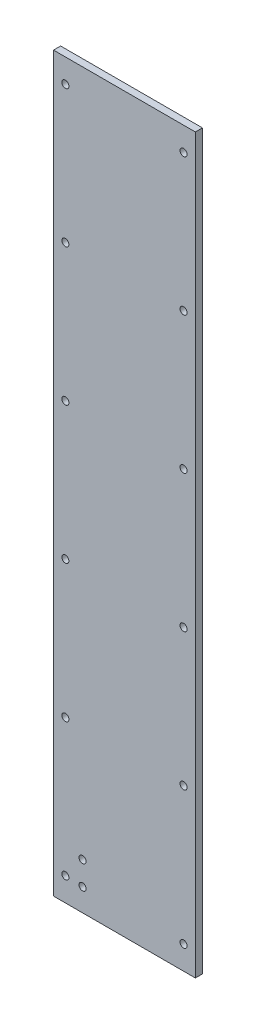
ISO-10303-21;
HEADER;
FILE_DESCRIPTION(('STEP AP214'),'2;1');
FILE_NAME('part.step','',(''),(''),'','','');
FILE_SCHEMA(('AUTOMOTIVE_DESIGN { 1 0 10303 214 1 1 1 1 }'));
ENDSEC;
DATA;
#1=APPLICATION_CONTEXT('core data for automotive mechanical design processes');
#2=APPLICATION_PROTOCOL_DEFINITION('international standard','automotive_design',2000,#1);
#3=PRODUCT_CONTEXT('',#1,'mechanical');
#4=PRODUCT('Part','Part','',(#3));
#5=PRODUCT_RELATED_PRODUCT_CATEGORY('part','',(#4));
#6=PRODUCT_DEFINITION_FORMATION('','',#4);
#7=PRODUCT_DEFINITION_CONTEXT('part definition',#1,'design');
#8=PRODUCT_DEFINITION('design','',#6,#7);
#9=PRODUCT_DEFINITION_SHAPE('','',#8);
#10=(LENGTH_UNIT() NAMED_UNIT(*) SI_UNIT(.MILLI.,.METRE.));
#11=(NAMED_UNIT(*) PLANE_ANGLE_UNIT() SI_UNIT($,.RADIAN.));
#12=(NAMED_UNIT(*) SI_UNIT($,.STERADIAN.) SOLID_ANGLE_UNIT());
#13=UNCERTAINTY_MEASURE_WITH_UNIT(LENGTH_MEASURE(1.E-05),#10,'distance_accuracy_value','');
#14=(GEOMETRIC_REPRESENTATION_CONTEXT(3) GLOBAL_UNCERTAINTY_ASSIGNED_CONTEXT((#13)) GLOBAL_UNIT_ASSIGNED_CONTEXT((#10,
#11,#12)) REPRESENTATION_CONTEXT('',''));
#15=CARTESIAN_POINT('',(0.,0.,0.));
#16=DIRECTION('',(0.,0.,1.));
#17=DIRECTION('',(1.,0.,0.));
#18=AXIS2_PLACEMENT_3D('',#15,#16,#17);
#19=CARTESIAN_POINT('',(-30.,0.,3.));
#20=DIRECTION('',(-1.,0.,0.));
#21=DIRECTION('',(0.,0.,1.));
#22=AXIS2_PLACEMENT_3D('',#19,#20,#21);
#23=PLANE('',#22);
#24=DIRECTION('',(0.,1.,0.));
#25=VECTOR('',#24,1.);
#26=CARTESIAN_POINT('',(-30.,0.,0.));
#27=LINE('',#26,#25);
#28=CARTESIAN_POINT('',(-30.,-155.,0.));
#29=VERTEX_POINT('',#28);
#30=CARTESIAN_POINT('',(-30.,155.,0.));
#31=VERTEX_POINT('',#30);
#32=EDGE_CURVE('E146',#29,#31,#27,.T.);
#33=ORIENTED_EDGE('',*,*,#32,.F.);
#34=DIRECTION('',(0.,0.,-1.));
#35=VECTOR('',#34,1.);
#36=CARTESIAN_POINT('',(-30.,-155.,3.));
#37=LINE('',#36,#35);
#38=CARTESIAN_POINT('',(-30.,-155.,3.));
#39=VERTEX_POINT('',#38);
#40=EDGE_CURVE('E11',#39,#29,#37,.T.);
#41=ORIENTED_EDGE('',*,*,#40,.F.);
#42=DIRECTION('',(0.,1.,0.));
#43=VECTOR('',#42,1.);
#44=CARTESIAN_POINT('',(-30.,0.,3.));
#45=LINE('',#44,#43);
#46=CARTESIAN_POINT('',(-30.,155.,3.));
#47=VERTEX_POINT('',#46);
#48=EDGE_CURVE('E97',#39,#47,#45,.T.);
#49=ORIENTED_EDGE('',*,*,#48,.T.);
#50=DIRECTION('',(0.,0.,-1.));
#51=VECTOR('',#50,1.);
#52=CARTESIAN_POINT('',(-30.,155.,3.));
#53=LINE('',#52,#51);
#54=EDGE_CURVE('E75',#47,#31,#53,.T.);
#55=ORIENTED_EDGE('',*,*,#54,.T.);
#56=EDGE_LOOP('',(#33,#41,#49,#55));
#57=FACE_BOUND('',#56,.T.);
#58=ADVANCED_FACE('F35',(#57),#23,.T.);
#59=CARTESIAN_POINT('',(0.,-155.,3.));
#60=DIRECTION('',(0.,-1.,0.));
#61=DIRECTION('',(0.,0.,-1.));
#62=AXIS2_PLACEMENT_3D('',#59,#60,#61);
#63=PLANE('',#62);
#64=DIRECTION('',(-1.,0.,0.));
#65=VECTOR('',#64,1.);
#66=CARTESIAN_POINT('',(0.,-155.,0.));
#67=LINE('',#66,#65);
#68=CARTESIAN_POINT('',(30.,-155.,0.));
#69=VERTEX_POINT('',#68);
#70=EDGE_CURVE('E87',#69,#29,#67,.T.);
#71=ORIENTED_EDGE('',*,*,#70,.F.);
#72=DIRECTION('',(0.,0.,-1.));
#73=VECTOR('',#72,1.);
#74=CARTESIAN_POINT('',(30.,-155.,3.));
#75=LINE('',#74,#73);
#76=CARTESIAN_POINT('',(30.,-155.,3.));
#77=VERTEX_POINT('',#76);
#78=EDGE_CURVE('E44',#77,#69,#75,.T.);
#79=ORIENTED_EDGE('',*,*,#78,.F.);
#80=DIRECTION('',(-1.,0.,0.));
#81=VECTOR('',#80,1.);
#82=CARTESIAN_POINT('',(0.,-155.,3.));
#83=LINE('',#82,#81);
#84=EDGE_CURVE('E85',#77,#39,#83,.T.);
#85=ORIENTED_EDGE('',*,*,#84,.T.);
#86=ORIENTED_EDGE('',*,*,#40,.T.);
#87=EDGE_LOOP('',(#71,#79,#85,#86));
#88=FACE_BOUND('',#87,.T.);
#89=ADVANCED_FACE('F83',(#88),#63,.T.);
#90=CARTESIAN_POINT('',(30.,0.,3.));
#91=DIRECTION('',(-1.,0.,0.));
#92=DIRECTION('',(0.,-1.,0.));
#93=AXIS2_PLACEMENT_3D('',#90,#91,#92);
#94=PLANE('',#93);
#95=DIRECTION('',(0.,1.,0.));
#96=VECTOR('',#95,1.);
#97=CARTESIAN_POINT('',(30.,0.,0.));
#98=LINE('',#97,#96);
#99=CARTESIAN_POINT('',(30.,155.,0.));
#100=VERTEX_POINT('',#99);
#101=EDGE_CURVE('E149',#69,#100,#98,.T.);
#102=ORIENTED_EDGE('',*,*,#101,.T.);
#103=DIRECTION('',(0.,0.,-1.));
#104=VECTOR('',#103,1.);
#105=CARTESIAN_POINT('',(30.,155.,3.));
#106=LINE('',#105,#104);
#107=CARTESIAN_POINT('',(30.,155.,3.));
#108=VERTEX_POINT('',#107);
#109=EDGE_CURVE('E90',#108,#100,#106,.T.);
#110=ORIENTED_EDGE('',*,*,#109,.F.);
#111=DIRECTION('',(0.,1.,0.));
#112=VECTOR('',#111,1.);
#113=CARTESIAN_POINT('',(30.,0.,3.));
#114=LINE('',#113,#112);
#115=EDGE_CURVE('E92',#77,#108,#114,.T.);
#116=ORIENTED_EDGE('',*,*,#115,.F.);
#117=ORIENTED_EDGE('',*,*,#78,.T.);
#118=EDGE_LOOP('',(#102,#110,#116,#117));
#119=FACE_BOUND('',#118,.T.);
#120=ADVANCED_FACE('F93',(#119),#94,.F.);
#121=CARTESIAN_POINT('',(25.,29.,3.));
#122=DIRECTION('',(0.,0.,-1.));
#123=DIRECTION('',(-1.,0.,0.));
#124=AXIS2_PLACEMENT_3D('',#121,#122,#123);
#125=CYLINDRICAL_SURFACE('',#124,1.5);
#126=CARTESIAN_POINT('',(25.,29.,3.));
#127=DIRECTION('',(0.,0.,1.));
#128=DIRECTION('',(1.,0.,0.));
#129=AXIS2_PLACEMENT_3D('',#126,#127,#128);
#130=CIRCLE('',#129,1.5);
#131=CARTESIAN_POINT('',(26.5,29.,3.));
#132=VERTEX_POINT('',#131);
#133=EDGE_CURVE('E107',#132,#132,#130,.F.);
#134=ORIENTED_EDGE('',*,*,#133,.F.);
#135=EDGE_LOOP('',(#134));
#136=FACE_BOUND('',#135,.T.);
#137=CARTESIAN_POINT('',(25.,29.,0.));
#138=DIRECTION('',(0.,0.,1.));
#139=DIRECTION('',(1.,0.,0.));
#140=AXIS2_PLACEMENT_3D('',#137,#138,#139);
#141=CIRCLE('',#140,1.5);
#142=CARTESIAN_POINT('',(26.5,29.,0.));
#143=VERTEX_POINT('',#142);
#144=EDGE_CURVE('E155',#143,#143,#141,.F.);
#145=ORIENTED_EDGE('',*,*,#144,.T.);
#146=EDGE_LOOP('',(#145));
#147=FACE_BOUND('',#146,.T.);
#148=ADVANCED_FACE('F263',(#136,#147),#125,.F.);
#149=CARTESIAN_POINT('',(25.0000000000001,-145.,3.));
#150=DIRECTION('',(0.,0.,-1.));
#151=DIRECTION('',(-1.,0.,0.));
#152=AXIS2_PLACEMENT_3D('',#149,#150,#151);
#153=CYLINDRICAL_SURFACE('',#152,1.5);
#154=CARTESIAN_POINT('',(25.0000000000001,-145.,3.));
#155=DIRECTION('',(0.,0.,1.));
#156=DIRECTION('',(1.,0.,0.));
#157=AXIS2_PLACEMENT_3D('',#154,#155,#156);
#158=CIRCLE('',#157,1.5);
#159=CARTESIAN_POINT('',(26.5000000000001,-145.,3.));
#160=VERTEX_POINT('',#159);
#161=EDGE_CURVE('E104',#160,#160,#158,.F.);
#162=ORIENTED_EDGE('',*,*,#161,.F.);
#163=EDGE_LOOP('',(#162));
#164=FACE_BOUND('',#163,.T.);
#165=CARTESIAN_POINT('',(25.0000000000001,-145.,0.));
#166=DIRECTION('',(0.,0.,1.));
#167=DIRECTION('',(1.,0.,0.));
#168=AXIS2_PLACEMENT_3D('',#165,#166,#167);
#169=CIRCLE('',#168,1.5);
#170=CARTESIAN_POINT('',(26.5000000000001,-145.,0.));
#171=VERTEX_POINT('',#170);
#172=EDGE_CURVE('E152',#171,#171,#169,.F.);
#173=ORIENTED_EDGE('',*,*,#172,.T.);
#174=EDGE_LOOP('',(#173));
#175=FACE_BOUND('',#174,.T.);
#176=ADVANCED_FACE('F266',(#164,#175),#153,.F.);
#177=CARTESIAN_POINT('',(0.,155.,3.));
#178=DIRECTION('',(0.,-1.,0.));
#179=DIRECTION('',(0.,0.,-1.));
#180=AXIS2_PLACEMENT_3D('',#177,#178,#179);
#181=PLANE('',#180);
#182=DIRECTION('',(-1.,0.,0.));
#183=VECTOR('',#182,1.);
#184=CARTESIAN_POINT('',(0.,155.,0.));
#185=LINE('',#184,#183);
#186=EDGE_CURVE('E68',#100,#31,#185,.T.);
#187=ORIENTED_EDGE('',*,*,#186,.T.);
#188=ORIENTED_EDGE('',*,*,#54,.F.);
#189=DIRECTION('',(-1.,0.,0.));
#190=VECTOR('',#189,1.);
#191=CARTESIAN_POINT('',(0.,155.,3.));
#192=LINE('',#191,#190);
#193=EDGE_CURVE('E52',#108,#47,#192,.T.);
#194=ORIENTED_EDGE('',*,*,#193,.F.);
#195=ORIENTED_EDGE('',*,*,#109,.T.);
#196=EDGE_LOOP('',(#187,#188,#194,#195));
#197=FACE_BOUND('',#196,.T.);
#198=ADVANCED_FACE('F164',(#197),#181,.F.);
#199=CARTESIAN_POINT('',(-25.,-145.,3.));
#200=DIRECTION('',(0.,0.,-1.));
#201=DIRECTION('',(-1.,0.,0.));
#202=AXIS2_PLACEMENT_3D('',#199,#200,#201);
#203=CYLINDRICAL_SURFACE('',#202,1.5);
#204=CARTESIAN_POINT('',(-25.,-145.,3.));
#205=DIRECTION('',(0.,0.,1.));
#206=DIRECTION('',(1.,0.,0.));
#207=AXIS2_PLACEMENT_3D('',#204,#205,#206);
#208=CIRCLE('',#207,1.5);
#209=CARTESIAN_POINT('',(-23.5,-145.,3.));
#210=VERTEX_POINT('',#209);
#211=EDGE_CURVE('E99',#210,#210,#208,.T.);
#212=ORIENTED_EDGE('',*,*,#211,.T.);
#213=EDGE_LOOP('',(#212));
#214=FACE_BOUND('',#213,.T.);
#215=CARTESIAN_POINT('',(-25.,-145.,0.));
#216=DIRECTION('',(0.,0.,1.));
#217=DIRECTION('',(1.,0.,0.));
#218=AXIS2_PLACEMENT_3D('',#215,#216,#217);
#219=CIRCLE('',#218,1.5);
#220=CARTESIAN_POINT('',(-23.5,-145.,0.));
#221=VERTEX_POINT('',#220);
#222=EDGE_CURVE('E143',#221,#221,#219,.T.);
#223=ORIENTED_EDGE('',*,*,#222,.F.);
#224=EDGE_LOOP('',(#223));
#225=FACE_BOUND('',#224,.T.);
#226=ADVANCED_FACE('F175',(#214,#225),#203,.F.);
#227=CARTESIAN_POINT('',(-25.,-87.,3.));
#228=DIRECTION('',(0.,0.,-1.));
#229=DIRECTION('',(-1.,0.,0.));
#230=AXIS2_PLACEMENT_3D('',#227,#228,#229);
#231=CYLINDRICAL_SURFACE('',#230,1.5);
#232=CARTESIAN_POINT('',(-25.,-87.,3.));
#233=DIRECTION('',(0.,0.,1.));
#234=DIRECTION('',(1.,0.,0.));
#235=AXIS2_PLACEMENT_3D('',#232,#233,#234);
#236=CIRCLE('',#235,1.5);
#237=CARTESIAN_POINT('',(-23.5,-87.,3.));
#238=VERTEX_POINT('',#237);
#239=EDGE_CURVE('E449',#238,#238,#236,.T.);
#240=ORIENTED_EDGE('',*,*,#239,.T.);
#241=EDGE_LOOP('',(#240));
#242=FACE_BOUND('',#241,.T.);
#243=CARTESIAN_POINT('',(-25.,-87.,0.));
#244=DIRECTION('',(0.,0.,1.));
#245=DIRECTION('',(1.,0.,0.));
#246=AXIS2_PLACEMENT_3D('',#243,#244,#245);
#247=CIRCLE('',#246,1.5);
#248=CARTESIAN_POINT('',(-23.5,-87.,0.));
#249=VERTEX_POINT('',#248);
#250=EDGE_CURVE('E140',#249,#249,#247,.T.);
#251=ORIENTED_EDGE('',*,*,#250,.F.);
#252=EDGE_LOOP('',(#251));
#253=FACE_BOUND('',#252,.T.);
#254=ADVANCED_FACE('F178',(#242,#253),#231,.F.);
#255=CARTESIAN_POINT('',(-25.,-29.,3.));
#256=DIRECTION('',(0.,0.,-1.));
#257=DIRECTION('',(-1.,0.,0.));
#258=AXIS2_PLACEMENT_3D('',#255,#256,#257);
#259=CYLINDRICAL_SURFACE('',#258,1.5);
#260=CARTESIAN_POINT('',(-25.,-29.,3.));
#261=DIRECTION('',(0.,0.,1.));
#262=DIRECTION('',(1.,0.,0.));
#263=AXIS2_PLACEMENT_3D('',#260,#261,#262);
#264=CIRCLE('',#263,1.5);
#265=CARTESIAN_POINT('',(-23.5,-29.,3.));
#266=VERTEX_POINT('',#265);
#267=EDGE_CURVE('E445',#266,#266,#264,.T.);
#268=ORIENTED_EDGE('',*,*,#267,.T.);
#269=EDGE_LOOP('',(#268));
#270=FACE_BOUND('',#269,.T.);
#271=CARTESIAN_POINT('',(-25.,-29.,0.));
#272=DIRECTION('',(0.,0.,1.));
#273=DIRECTION('',(1.,0.,0.));
#274=AXIS2_PLACEMENT_3D('',#271,#272,#273);
#275=CIRCLE('',#274,1.5);
#276=CARTESIAN_POINT('',(-23.5,-29.,0.));
#277=VERTEX_POINT('',#276);
#278=EDGE_CURVE('E137',#277,#277,#275,.T.);
#279=ORIENTED_EDGE('',*,*,#278,.F.);
#280=EDGE_LOOP('',(#279));
#281=FACE_BOUND('',#280,.T.);
#282=ADVANCED_FACE('F182',(#270,#281),#259,.F.);
#283=CARTESIAN_POINT('',(-25.,29.,3.));
#284=DIRECTION('',(0.,0.,-1.));
#285=DIRECTION('',(-1.,0.,0.));
#286=AXIS2_PLACEMENT_3D('',#283,#284,#285);
#287=CYLINDRICAL_SURFACE('',#286,1.5);
#288=CARTESIAN_POINT('',(-25.,29.,3.));
#289=DIRECTION('',(0.,0.,1.));
#290=DIRECTION('',(1.,0.,0.));
#291=AXIS2_PLACEMENT_3D('',#288,#289,#290);
#292=CIRCLE('',#291,1.5);
#293=CARTESIAN_POINT('',(-23.5,29.,3.));
#294=VERTEX_POINT('',#293);
#295=EDGE_CURVE('E441',#294,#294,#292,.T.);
#296=ORIENTED_EDGE('',*,*,#295,.T.);
#297=EDGE_LOOP('',(#296));
#298=FACE_BOUND('',#297,.T.);
#299=CARTESIAN_POINT('',(-25.,29.,0.));
#300=DIRECTION('',(0.,0.,1.));
#301=DIRECTION('',(1.,0.,0.));
#302=AXIS2_PLACEMENT_3D('',#299,#300,#301);
#303=CIRCLE('',#302,1.5);
#304=CARTESIAN_POINT('',(-23.5,29.,0.));
#305=VERTEX_POINT('',#304);
#306=EDGE_CURVE('E134',#305,#305,#303,.T.);
#307=ORIENTED_EDGE('',*,*,#306,.F.);
#308=EDGE_LOOP('',(#307));
#309=FACE_BOUND('',#308,.T.);
#310=ADVANCED_FACE('F186',(#298,#309),#287,.F.);
#311=CARTESIAN_POINT('',(-25.,87.,3.));
#312=DIRECTION('',(0.,0.,-1.));
#313=DIRECTION('',(-1.,0.,0.));
#314=AXIS2_PLACEMENT_3D('',#311,#312,#313);
#315=CYLINDRICAL_SURFACE('',#314,1.5);
#316=CARTESIAN_POINT('',(-25.,87.,3.));
#317=DIRECTION('',(0.,0.,1.));
#318=DIRECTION('',(1.,0.,0.));
#319=AXIS2_PLACEMENT_3D('',#316,#317,#318);
#320=CIRCLE('',#319,1.5);
#321=CARTESIAN_POINT('',(-23.5,87.,3.));
#322=VERTEX_POINT('',#321);
#323=EDGE_CURVE('E437',#322,#322,#320,.T.);
#324=ORIENTED_EDGE('',*,*,#323,.T.);
#325=EDGE_LOOP('',(#324));
#326=FACE_BOUND('',#325,.T.);
#327=CARTESIAN_POINT('',(-25.,87.,0.));
#328=DIRECTION('',(0.,0.,1.));
#329=DIRECTION('',(1.,0.,0.));
#330=AXIS2_PLACEMENT_3D('',#327,#328,#329);
#331=CIRCLE('',#330,1.5);
#332=CARTESIAN_POINT('',(-23.5,87.,0.));
#333=VERTEX_POINT('',#332);
#334=EDGE_CURVE('E131',#333,#333,#331,.T.);
#335=ORIENTED_EDGE('',*,*,#334,.F.);
#336=EDGE_LOOP('',(#335));
#337=FACE_BOUND('',#336,.T.);
#338=ADVANCED_FACE('F190',(#326,#337),#315,.F.);
#339=CARTESIAN_POINT('',(-25.,145.,3.));
#340=DIRECTION('',(0.,0.,-1.));
#341=DIRECTION('',(-1.,0.,0.));
#342=AXIS2_PLACEMENT_3D('',#339,#340,#341);
#343=CYLINDRICAL_SURFACE('',#342,1.5);
#344=CARTESIAN_POINT('',(-25.,145.,3.));
#345=DIRECTION('',(0.,0.,1.));
#346=DIRECTION('',(1.,0.,0.));
#347=AXIS2_PLACEMENT_3D('',#344,#345,#346);
#348=CIRCLE('',#347,1.5);
#349=CARTESIAN_POINT('',(-23.5,145.,3.));
#350=VERTEX_POINT('',#349);
#351=EDGE_CURVE('E433',#350,#350,#348,.T.);
#352=ORIENTED_EDGE('',*,*,#351,.T.);
#353=EDGE_LOOP('',(#352));
#354=FACE_BOUND('',#353,.T.);
#355=CARTESIAN_POINT('',(-25.,145.,0.));
#356=DIRECTION('',(0.,0.,1.));
#357=DIRECTION('',(1.,0.,0.));
#358=AXIS2_PLACEMENT_3D('',#355,#356,#357);
#359=CIRCLE('',#358,1.5);
#360=CARTESIAN_POINT('',(-23.5,145.,0.));
#361=VERTEX_POINT('',#360);
#362=EDGE_CURVE('E128',#361,#361,#359,.T.);
#363=ORIENTED_EDGE('',*,*,#362,.F.);
#364=EDGE_LOOP('',(#363));
#365=FACE_BOUND('',#364,.T.);
#366=ADVANCED_FACE('F194',(#354,#365),#343,.F.);
#367=CARTESIAN_POINT('',(25.,-87.,3.));
#368=DIRECTION('',(0.,0.,-1.));
#369=DIRECTION('',(-1.,0.,0.));
#370=AXIS2_PLACEMENT_3D('',#367,#368,#369);
#371=CYLINDRICAL_SURFACE('',#370,1.5);
#372=CARTESIAN_POINT('',(25.,-87.,3.));
#373=DIRECTION('',(0.,0.,1.));
#374=DIRECTION('',(1.,0.,0.));
#375=AXIS2_PLACEMENT_3D('',#372,#373,#374);
#376=CIRCLE('',#375,1.5);
#377=CARTESIAN_POINT('',(26.5,-87.,3.));
#378=VERTEX_POINT('',#377);
#379=EDGE_CURVE('E429',#378,#378,#376,.F.);
#380=ORIENTED_EDGE('',*,*,#379,.F.);
#381=EDGE_LOOP('',(#380));
#382=FACE_BOUND('',#381,.T.);
#383=CARTESIAN_POINT('',(25.,-87.,0.));
#384=DIRECTION('',(0.,0.,1.));
#385=DIRECTION('',(1.,0.,0.));
#386=AXIS2_PLACEMENT_3D('',#383,#384,#385);
#387=CIRCLE('',#386,1.5);
#388=CARTESIAN_POINT('',(26.5,-87.,0.));
#389=VERTEX_POINT('',#388);
#390=EDGE_CURVE('E125',#389,#389,#387,.F.);
#391=ORIENTED_EDGE('',*,*,#390,.T.);
#392=EDGE_LOOP('',(#391));
#393=FACE_BOUND('',#392,.T.);
#394=ADVANCED_FACE('F198',(#382,#393),#371,.F.);
#395=CARTESIAN_POINT('',(25.,-29.,3.));
#396=DIRECTION('',(0.,0.,-1.));
#397=DIRECTION('',(-1.,0.,0.));
#398=AXIS2_PLACEMENT_3D('',#395,#396,#397);
#399=CYLINDRICAL_SURFACE('',#398,1.5);
#400=CARTESIAN_POINT('',(25.,-29.,3.));
#401=DIRECTION('',(0.,0.,1.));
#402=DIRECTION('',(1.,0.,0.));
#403=AXIS2_PLACEMENT_3D('',#400,#401,#402);
#404=CIRCLE('',#403,1.5);
#405=CARTESIAN_POINT('',(26.5,-29.,3.));
#406=VERTEX_POINT('',#405);
#407=EDGE_CURVE('E425',#406,#406,#404,.F.);
#408=ORIENTED_EDGE('',*,*,#407,.F.);
#409=EDGE_LOOP('',(#408));
#410=FACE_BOUND('',#409,.T.);
#411=CARTESIAN_POINT('',(25.,-29.,0.));
#412=DIRECTION('',(0.,0.,1.));
#413=DIRECTION('',(1.,0.,0.));
#414=AXIS2_PLACEMENT_3D('',#411,#412,#413);
#415=CIRCLE('',#414,1.5);
#416=CARTESIAN_POINT('',(26.5,-29.,0.));
#417=VERTEX_POINT('',#416);
#418=EDGE_CURVE('E122',#417,#417,#415,.F.);
#419=ORIENTED_EDGE('',*,*,#418,.T.);
#420=EDGE_LOOP('',(#419));
#421=FACE_BOUND('',#420,.T.);
#422=ADVANCED_FACE('F202',(#410,#421),#399,.F.);
#423=CARTESIAN_POINT('',(25.,87.,3.));
#424=DIRECTION('',(0.,0.,-1.));
#425=DIRECTION('',(-1.,0.,0.));
#426=AXIS2_PLACEMENT_3D('',#423,#424,#425);
#427=CYLINDRICAL_SURFACE('',#426,1.5);
#428=CARTESIAN_POINT('',(25.,87.,3.));
#429=DIRECTION('',(0.,0.,1.));
#430=DIRECTION('',(1.,0.,0.));
#431=AXIS2_PLACEMENT_3D('',#428,#429,#430);
#432=CIRCLE('',#431,1.5);
#433=CARTESIAN_POINT('',(26.5,87.,3.));
#434=VERTEX_POINT('',#433);
#435=EDGE_CURVE('E421',#434,#434,#432,.F.);
#436=ORIENTED_EDGE('',*,*,#435,.F.);
#437=EDGE_LOOP('',(#436));
#438=FACE_BOUND('',#437,.T.);
#439=CARTESIAN_POINT('',(25.,87.,0.));
#440=DIRECTION('',(0.,0.,1.));
#441=DIRECTION('',(1.,0.,0.));
#442=AXIS2_PLACEMENT_3D('',#439,#440,#441);
#443=CIRCLE('',#442,1.5);
#444=CARTESIAN_POINT('',(26.5,87.,0.));
#445=VERTEX_POINT('',#444);
#446=EDGE_CURVE('E119',#445,#445,#443,.F.);
#447=ORIENTED_EDGE('',*,*,#446,.T.);
#448=EDGE_LOOP('',(#447));
#449=FACE_BOUND('',#448,.T.);
#450=ADVANCED_FACE('F206',(#438,#449),#427,.F.);
#451=CARTESIAN_POINT('',(-17.7283088628926,-135.45532099729,3.));
#452=DIRECTION('',(0.,0.,-1.));
#453=DIRECTION('',(-1.,0.,0.));
#454=AXIS2_PLACEMENT_3D('',#451,#452,#453);
#455=CYLINDRICAL_SURFACE('',#454,1.5);
#456=CARTESIAN_POINT('',(-17.7283088628926,-135.45532099729,3.));
#457=DIRECTION('',(0.,0.,1.));
#458=DIRECTION('',(1.,0.,0.));
#459=AXIS2_PLACEMENT_3D('',#456,#457,#458);
#460=CIRCLE('',#459,1.5);
#461=CARTESIAN_POINT('',(-16.2283088628926,-135.45532099729,3.));
#462=VERTEX_POINT('',#461);
#463=EDGE_CURVE('E221',#462,#462,#460,.T.);
#464=ORIENTED_EDGE('',*,*,#463,.T.);
#465=EDGE_LOOP('',(#464));
#466=FACE_BOUND('',#465,.T.);
#467=CARTESIAN_POINT('',(-17.7283088628926,-135.45532099729,0.));
#468=DIRECTION('',(0.,0.,1.));
#469=DIRECTION('',(1.,0.,0.));
#470=AXIS2_PLACEMENT_3D('',#467,#468,#469);
#471=CIRCLE('',#470,1.5);
#472=CARTESIAN_POINT('',(-16.2283088628926,-135.45532099729,0.));
#473=VERTEX_POINT('',#472);
#474=EDGE_CURVE('E116',#473,#473,#471,.T.);
#475=ORIENTED_EDGE('',*,*,#474,.F.);
#476=EDGE_LOOP('',(#475));
#477=FACE_BOUND('',#476,.T.);
#478=ADVANCED_FACE('F209',(#466,#477),#455,.F.);
#479=CARTESIAN_POINT('',(-17.7283088628931,-145.45532099729,3.));
#480=DIRECTION('',(0.,0.,-1.));
#481=DIRECTION('',(-1.,0.,0.));
#482=AXIS2_PLACEMENT_3D('',#479,#480,#481);
#483=CYLINDRICAL_SURFACE('',#482,1.49999999999999);
#484=CARTESIAN_POINT('',(-17.7283088628931,-145.45532099729,3.));
#485=DIRECTION('',(0.,0.,1.));
#486=DIRECTION('',(1.,0.,0.));
#487=AXIS2_PLACEMENT_3D('',#484,#485,#486);
#488=CIRCLE('',#487,1.49999999999999);
#489=CARTESIAN_POINT('',(-16.2283088628931,-145.45532099729,3.));
#490=VERTEX_POINT('',#489);
#491=EDGE_CURVE('E161',#490,#490,#488,.T.);
#492=ORIENTED_EDGE('',*,*,#491,.T.);
#493=EDGE_LOOP('',(#492));
#494=FACE_BOUND('',#493,.T.);
#495=CARTESIAN_POINT('',(-17.7283088628931,-145.45532099729,0.));
#496=DIRECTION('',(0.,0.,1.));
#497=DIRECTION('',(1.,0.,0.));
#498=AXIS2_PLACEMENT_3D('',#495,#496,#497);
#499=CIRCLE('',#498,1.49999999999999);
#500=CARTESIAN_POINT('',(-16.2283088628931,-145.45532099729,0.));
#501=VERTEX_POINT('',#500);
#502=EDGE_CURVE('E113',#501,#501,#499,.T.);
#503=ORIENTED_EDGE('',*,*,#502,.F.);
#504=EDGE_LOOP('',(#503));
#505=FACE_BOUND('',#504,.T.);
#506=ADVANCED_FACE('F37',(#494,#505),#483,.F.);
#507=CARTESIAN_POINT('',(25.,145.,3.));
#508=DIRECTION('',(0.,0.,-1.));
#509=DIRECTION('',(-1.,0.,0.));
#510=AXIS2_PLACEMENT_3D('',#507,#508,#509);
#511=CYLINDRICAL_SURFACE('',#510,1.5);
#512=CARTESIAN_POINT('',(25.,145.,3.));
#513=DIRECTION('',(0.,0.,1.));
#514=DIRECTION('',(1.,0.,0.));
#515=AXIS2_PLACEMENT_3D('',#512,#513,#514);
#516=CIRCLE('',#515,1.5);
#517=CARTESIAN_POINT('',(26.5,145.,3.));
#518=VERTEX_POINT('',#517);
#519=EDGE_CURVE('E110',#518,#518,#516,.F.);
#520=ORIENTED_EDGE('',*,*,#519,.F.);
#521=EDGE_LOOP('',(#520));
#522=FACE_BOUND('',#521,.T.);
#523=CARTESIAN_POINT('',(25.,145.,0.));
#524=DIRECTION('',(0.,0.,1.));
#525=DIRECTION('',(1.,0.,0.));
#526=AXIS2_PLACEMENT_3D('',#523,#524,#525);
#527=CIRCLE('',#526,1.5);
#528=CARTESIAN_POINT('',(26.5,145.,0.));
#529=VERTEX_POINT('',#528);
#530=EDGE_CURVE('E158',#529,#529,#527,.F.);
#531=ORIENTED_EDGE('',*,*,#530,.T.);
#532=EDGE_LOOP('',(#531));
#533=FACE_BOUND('',#532,.T.);
#534=ADVANCED_FACE('F216',(#522,#533),#511,.F.);
#535=CARTESIAN_POINT('',(0.,0.,3.));
#536=DIRECTION('',(0.,0.,1.));
#537=DIRECTION('',(1.,0.,0.));
#538=AXIS2_PLACEMENT_3D('',#535,#536,#537);
#539=PLANE('',#538);
#540=ORIENTED_EDGE('',*,*,#491,.F.);
#541=EDGE_LOOP('',(#540));
#542=FACE_BOUND('',#541,.T.);
#543=ORIENTED_EDGE('',*,*,#463,.F.);
#544=EDGE_LOOP('',(#543));
#545=FACE_BOUND('',#544,.T.);
#546=ORIENTED_EDGE('',*,*,#435,.T.);
#547=EDGE_LOOP('',(#546));
#548=FACE_BOUND('',#547,.T.);
#549=ORIENTED_EDGE('',*,*,#407,.T.);
#550=EDGE_LOOP('',(#549));
#551=FACE_BOUND('',#550,.T.);
#552=ORIENTED_EDGE('',*,*,#379,.T.);
#553=EDGE_LOOP('',(#552));
#554=FACE_BOUND('',#553,.T.);
#555=ORIENTED_EDGE('',*,*,#351,.F.);
#556=EDGE_LOOP('',(#555));
#557=FACE_BOUND('',#556,.T.);
#558=ORIENTED_EDGE('',*,*,#323,.F.);
#559=EDGE_LOOP('',(#558));
#560=FACE_BOUND('',#559,.T.);
#561=ORIENTED_EDGE('',*,*,#295,.F.);
#562=EDGE_LOOP('',(#561));
#563=FACE_BOUND('',#562,.T.);
#564=ORIENTED_EDGE('',*,*,#267,.F.);
#565=EDGE_LOOP('',(#564));
#566=FACE_BOUND('',#565,.T.);
#567=ORIENTED_EDGE('',*,*,#239,.F.);
#568=EDGE_LOOP('',(#567));
#569=FACE_BOUND('',#568,.T.);
#570=ORIENTED_EDGE('',*,*,#211,.F.);
#571=EDGE_LOOP('',(#570));
#572=FACE_BOUND('',#571,.T.);
#573=ORIENTED_EDGE('',*,*,#48,.F.);
#574=ORIENTED_EDGE('',*,*,#84,.F.);
#575=ORIENTED_EDGE('',*,*,#115,.T.);
#576=ORIENTED_EDGE('',*,*,#193,.T.);
#577=EDGE_LOOP('',(#573,#574,#575,#576));
#578=FACE_BOUND('',#577,.T.);
#579=ORIENTED_EDGE('',*,*,#161,.T.);
#580=EDGE_LOOP('',(#579));
#581=FACE_BOUND('',#580,.T.);
#582=ORIENTED_EDGE('',*,*,#133,.T.);
#583=EDGE_LOOP('',(#582));
#584=FACE_BOUND('',#583,.T.);
#585=ORIENTED_EDGE('',*,*,#519,.T.);
#586=EDGE_LOOP('',(#585));
#587=FACE_BOUND('',#586,.T.);
#588=ADVANCED_FACE('F95',(#542,#545,#548,#551,#554,#557,#560,#563,#566,#569,#572,#578,#581,#584,
#587),#539,.T.);
#589=CARTESIAN_POINT('',(0.,0.,0.));
#590=DIRECTION('',(0.,0.,1.));
#591=DIRECTION('',(1.,0.,0.));
#592=AXIS2_PLACEMENT_3D('',#589,#590,#591);
#593=PLANE('',#592);
#594=ORIENTED_EDGE('',*,*,#502,.T.);
#595=EDGE_LOOP('',(#594));
#596=FACE_BOUND('',#595,.T.);
#597=ORIENTED_EDGE('',*,*,#474,.T.);
#598=EDGE_LOOP('',(#597));
#599=FACE_BOUND('',#598,.T.);
#600=ORIENTED_EDGE('',*,*,#446,.F.);
#601=EDGE_LOOP('',(#600));
#602=FACE_BOUND('',#601,.T.);
#603=ORIENTED_EDGE('',*,*,#418,.F.);
#604=EDGE_LOOP('',(#603));
#605=FACE_BOUND('',#604,.T.);
#606=ORIENTED_EDGE('',*,*,#390,.F.);
#607=EDGE_LOOP('',(#606));
#608=FACE_BOUND('',#607,.T.);
#609=ORIENTED_EDGE('',*,*,#362,.T.);
#610=EDGE_LOOP('',(#609));
#611=FACE_BOUND('',#610,.T.);
#612=ORIENTED_EDGE('',*,*,#334,.T.);
#613=EDGE_LOOP('',(#612));
#614=FACE_BOUND('',#613,.T.);
#615=ORIENTED_EDGE('',*,*,#306,.T.);
#616=EDGE_LOOP('',(#615));
#617=FACE_BOUND('',#616,.T.);
#618=ORIENTED_EDGE('',*,*,#278,.T.);
#619=EDGE_LOOP('',(#618));
#620=FACE_BOUND('',#619,.T.);
#621=ORIENTED_EDGE('',*,*,#250,.T.);
#622=EDGE_LOOP('',(#621));
#623=FACE_BOUND('',#622,.T.);
#624=ORIENTED_EDGE('',*,*,#222,.T.);
#625=EDGE_LOOP('',(#624));
#626=FACE_BOUND('',#625,.T.);
#627=ORIENTED_EDGE('',*,*,#32,.T.);
#628=ORIENTED_EDGE('',*,*,#186,.F.);
#629=ORIENTED_EDGE('',*,*,#101,.F.);
#630=ORIENTED_EDGE('',*,*,#70,.T.);
#631=EDGE_LOOP('',(#627,#628,#629,#630));
#632=FACE_BOUND('',#631,.T.);
#633=ORIENTED_EDGE('',*,*,#172,.F.);
#634=EDGE_LOOP('',(#633));
#635=FACE_BOUND('',#634,.T.);
#636=ORIENTED_EDGE('',*,*,#144,.F.);
#637=EDGE_LOOP('',(#636));
#638=FACE_BOUND('',#637,.T.);
#639=ORIENTED_EDGE('',*,*,#530,.F.);
#640=EDGE_LOOP('',(#639));
#641=FACE_BOUND('',#640,.T.);
#642=ADVANCED_FACE('F165',(#596,#599,#602,#605,#608,#611,#614,#617,#620,#623,#626,#632,#635,
#638,#641),#593,.F.);
#643=CLOSED_SHELL('',(#58,#89,#120,#148,#176,#198,#226,#254,#282,#310,#338,#366,#394,#422,#450,
#478,#506,#534,#588,#642));
#644=MANIFOLD_SOLID_BREP('B2',#643);
#645=ADVANCED_BREP_SHAPE_REPRESENTATION('',(#18,#644),#14);
#646=SHAPE_DEFINITION_REPRESENTATION(#9,#645);
ENDSEC;
END-ISO-10303-21;
